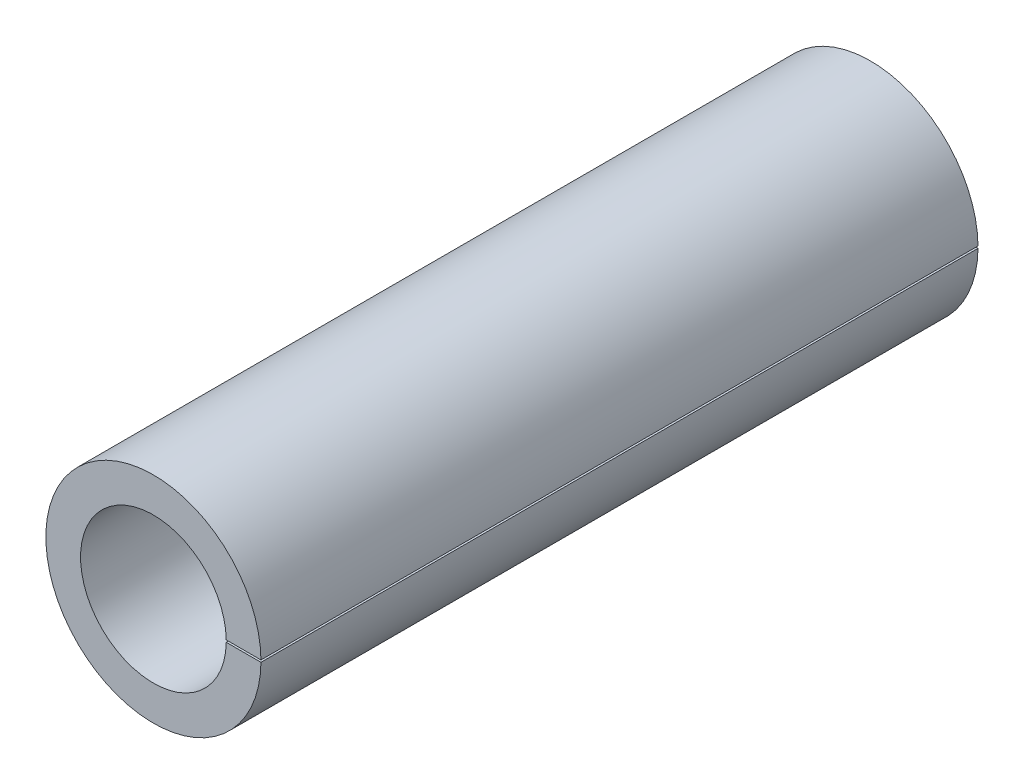
ISO-10303-21;
HEADER;
FILE_DESCRIPTION(('STEP AP214'),'2;1');
FILE_NAME('part.step','',(''),(''),'','','');
FILE_SCHEMA(('AUTOMOTIVE_DESIGN { 1 0 10303 214 1 1 1 1 }'));
ENDSEC;
DATA;
#1=APPLICATION_CONTEXT('core data for automotive mechanical design processes');
#2=APPLICATION_PROTOCOL_DEFINITION('international standard','automotive_design',2000,#1);
#3=PRODUCT_CONTEXT('',#1,'mechanical');
#4=PRODUCT('Part','Part','',(#3));
#5=PRODUCT_RELATED_PRODUCT_CATEGORY('part','',(#4));
#6=PRODUCT_DEFINITION_FORMATION('','',#4);
#7=PRODUCT_DEFINITION_CONTEXT('part definition',#1,'design');
#8=PRODUCT_DEFINITION('design','',#6,#7);
#9=PRODUCT_DEFINITION_SHAPE('','',#8);
#10=(LENGTH_UNIT() NAMED_UNIT(*) SI_UNIT(.MILLI.,.METRE.));
#11=(NAMED_UNIT(*) PLANE_ANGLE_UNIT() SI_UNIT($,.RADIAN.));
#12=(NAMED_UNIT(*) SI_UNIT($,.STERADIAN.) SOLID_ANGLE_UNIT());
#13=UNCERTAINTY_MEASURE_WITH_UNIT(LENGTH_MEASURE(1.E-05),#10,'distance_accuracy_value','');
#14=(GEOMETRIC_REPRESENTATION_CONTEXT(3) GLOBAL_UNCERTAINTY_ASSIGNED_CONTEXT((#13)) GLOBAL_UNIT_ASSIGNED_CONTEXT((#10,
#11,#12)) REPRESENTATION_CONTEXT('',''));
#15=CARTESIAN_POINT('',(0.,0.,0.));
#16=DIRECTION('',(0.,0.,1.));
#17=DIRECTION('',(1.,0.,0.));
#18=AXIS2_PLACEMENT_3D('',#15,#16,#17);
#19=CARTESIAN_POINT('',(0.,0.,15.875));
#20=DIRECTION('',(0.,0.,-1.));
#21=DIRECTION('',(-1.,0.,0.));
#22=AXIS2_PLACEMENT_3D('',#19,#20,#21);
#23=CYLINDRICAL_SURFACE('',#22,4.7625);
#24=DIRECTION('',(0.,0.,-1.));
#25=VECTOR('',#24,1.);
#26=CARTESIAN_POINT('',(4.76228739682939,0.0450000000000017,15.875));
#27=LINE('',#26,#25);
#28=CARTESIAN_POINT('',(4.76228739682939,0.0450000000000017,15.875));
#29=VERTEX_POINT('',#28);
#30=CARTESIAN_POINT('',(4.76228739682939,0.0450000000000017,-15.875));
#31=VERTEX_POINT('',#30);
#32=EDGE_CURVE('E114',#29,#31,#27,.T.);
#33=ORIENTED_EDGE('',*,*,#32,.T.);
#34=CARTESIAN_POINT('',(0.,0.,-15.875));
#35=DIRECTION('',(0.,0.,1.));
#36=DIRECTION('',(1.,0.,0.));
#37=AXIS2_PLACEMENT_3D('',#34,#35,#36);
#38=CIRCLE('',#37,4.7625);
#39=CARTESIAN_POINT('',(4.76228739682939,-0.045,-15.875));
#40=VERTEX_POINT('',#39);
#41=EDGE_CURVE('E108',#31,#40,#38,.T.);
#42=ORIENTED_EDGE('',*,*,#41,.T.);
#43=DIRECTION('',(0.,0.,-1.));
#44=VECTOR('',#43,1.);
#45=CARTESIAN_POINT('',(4.76228739682939,-0.045,15.875));
#46=LINE('',#45,#44);
#47=CARTESIAN_POINT('',(4.76228739682939,-0.045,15.875));
#48=VERTEX_POINT('',#47);
#49=EDGE_CURVE('E11',#48,#40,#46,.T.);
#50=ORIENTED_EDGE('',*,*,#49,.F.);
#51=CARTESIAN_POINT('',(0.,0.,15.875));
#52=DIRECTION('',(0.,0.,1.));
#53=DIRECTION('',(1.,0.,0.));
#54=AXIS2_PLACEMENT_3D('',#51,#52,#53);
#55=CIRCLE('',#54,4.7625);
#56=EDGE_CURVE('E124',#29,#48,#55,.T.);
#57=ORIENTED_EDGE('',*,*,#56,.F.);
#58=EDGE_LOOP('',(#33,#42,#50,#57));
#59=FACE_BOUND('',#58,.T.);
#60=ADVANCED_FACE('F47',(#59),#23,.T.);
#61=CARTESIAN_POINT('',(3.22548610910046,-0.045,15.875));
#62=DIRECTION('',(0.,-1.,0.));
#63=DIRECTION('',(0.,0.,-1.));
#64=AXIS2_PLACEMENT_3D('',#61,#62,#63);
#65=PLANE('',#64);
#66=ORIENTED_EDGE('',*,*,#49,.T.);
#67=DIRECTION('',(-1.,0.,0.));
#68=VECTOR('',#67,1.);
#69=CARTESIAN_POINT('',(3.22548610910046,-0.045,-15.875));
#70=LINE('',#69,#68);
#71=CARTESIAN_POINT('',(3.22548610910046,-0.045,-15.875));
#72=VERTEX_POINT('',#71);
#73=EDGE_CURVE('E98',#40,#72,#70,.T.);
#74=ORIENTED_EDGE('',*,*,#73,.T.);
#75=DIRECTION('',(0.,0.,-1.));
#76=VECTOR('',#75,1.);
#77=CARTESIAN_POINT('',(3.22548610910046,-0.045,15.875));
#78=LINE('',#77,#76);
#79=CARTESIAN_POINT('',(3.22548610910046,-0.045,15.875));
#80=VERTEX_POINT('',#79);
#81=EDGE_CURVE('E55',#80,#72,#78,.T.);
#82=ORIENTED_EDGE('',*,*,#81,.F.);
#83=DIRECTION('',(-1.,0.,0.));
#84=VECTOR('',#83,1.);
#85=CARTESIAN_POINT('',(3.22548610910046,-0.045,15.875));
#86=LINE('',#85,#84);
#87=EDGE_CURVE('E99',#48,#80,#86,.T.);
#88=ORIENTED_EDGE('',*,*,#87,.F.);
#89=EDGE_LOOP('',(#66,#74,#82,#88));
#90=FACE_BOUND('',#89,.T.);
#91=ADVANCED_FACE('F96',(#90),#65,.F.);
#92=CARTESIAN_POINT('',(0.,0.,15.875));
#93=DIRECTION('',(0.,0.,-1.));
#94=DIRECTION('',(-1.,0.,0.));
#95=AXIS2_PLACEMENT_3D('',#92,#93,#94);
#96=CYLINDRICAL_SURFACE('',#95,3.2258);
#97=ORIENTED_EDGE('',*,*,#81,.T.);
#98=CARTESIAN_POINT('',(0.,0.,-15.875));
#99=DIRECTION('',(0.,0.,-1.));
#100=DIRECTION('',(1.,0.,0.));
#101=AXIS2_PLACEMENT_3D('',#98,#99,#100);
#102=CIRCLE('',#101,3.2258);
#103=CARTESIAN_POINT('',(3.22548610910046,0.0450000000000012,-15.875));
#104=VERTEX_POINT('',#103);
#105=EDGE_CURVE('E111',#72,#104,#102,.T.);
#106=ORIENTED_EDGE('',*,*,#105,.T.);
#107=DIRECTION('',(0.,0.,-1.));
#108=VECTOR('',#107,1.);
#109=CARTESIAN_POINT('',(3.22548610910046,0.0450000000000012,15.875));
#110=LINE('',#109,#108);
#111=CARTESIAN_POINT('',(3.22548610910046,0.0450000000000012,15.875));
#112=VERTEX_POINT('',#111);
#113=EDGE_CURVE('E135',#112,#104,#110,.T.);
#114=ORIENTED_EDGE('',*,*,#113,.F.);
#115=CARTESIAN_POINT('',(0.,0.,15.875));
#116=DIRECTION('',(0.,0.,-1.));
#117=DIRECTION('',(1.,0.,0.));
#118=AXIS2_PLACEMENT_3D('',#115,#116,#117);
#119=CIRCLE('',#118,3.2258);
#120=EDGE_CURVE('E71',#80,#112,#119,.T.);
#121=ORIENTED_EDGE('',*,*,#120,.F.);
#122=EDGE_LOOP('',(#97,#106,#114,#121));
#123=FACE_BOUND('',#122,.T.);
#124=ADVANCED_FACE('F140',(#123),#96,.F.);
#125=CARTESIAN_POINT('',(3.22548610910046,0.0450000000000012,15.875));
#126=DIRECTION('',(0.,1.,0.));
#127=DIRECTION('',(-1.,0.,0.));
#128=AXIS2_PLACEMENT_3D('',#125,#126,#127);
#129=PLANE('',#128);
#130=ORIENTED_EDGE('',*,*,#113,.T.);
#131=DIRECTION('',(1.,0.,0.));
#132=VECTOR('',#131,1.);
#133=CARTESIAN_POINT('',(3.22548610910046,0.0450000000000012,-15.875));
#134=LINE('',#133,#132);
#135=EDGE_CURVE('E121',#104,#31,#134,.T.);
#136=ORIENTED_EDGE('',*,*,#135,.T.);
#137=ORIENTED_EDGE('',*,*,#32,.F.);
#138=DIRECTION('',(1.,0.,0.));
#139=VECTOR('',#138,1.);
#140=CARTESIAN_POINT('',(3.22548610910046,0.0450000000000012,15.875));
#141=LINE('',#140,#139);
#142=EDGE_CURVE('E64',#112,#29,#141,.T.);
#143=ORIENTED_EDGE('',*,*,#142,.F.);
#144=EDGE_LOOP('',(#130,#136,#137,#143));
#145=FACE_BOUND('',#144,.T.);
#146=ADVANCED_FACE('F142',(#145),#129,.F.);
#147=CARTESIAN_POINT('',(0.,0.,15.875));
#148=DIRECTION('',(0.,0.,1.));
#149=DIRECTION('',(1.,0.,0.));
#150=AXIS2_PLACEMENT_3D('',#147,#148,#149);
#151=PLANE('',#150);
#152=ORIENTED_EDGE('',*,*,#56,.T.);
#153=ORIENTED_EDGE('',*,*,#87,.T.);
#154=ORIENTED_EDGE('',*,*,#120,.T.);
#155=ORIENTED_EDGE('',*,*,#142,.T.);
#156=EDGE_LOOP('',(#152,#153,#154,#155));
#157=FACE_BOUND('',#156,.T.);
#158=ADVANCED_FACE('F143',(#157),#151,.T.);
#159=CARTESIAN_POINT('',(0.,0.,-15.875));
#160=DIRECTION('',(0.,0.,1.));
#161=DIRECTION('',(1.,0.,0.));
#162=AXIS2_PLACEMENT_3D('',#159,#160,#161);
#163=PLANE('',#162);
#164=ORIENTED_EDGE('',*,*,#41,.F.);
#165=ORIENTED_EDGE('',*,*,#135,.F.);
#166=ORIENTED_EDGE('',*,*,#105,.F.);
#167=ORIENTED_EDGE('',*,*,#73,.F.);
#168=EDGE_LOOP('',(#164,#165,#166,#167));
#169=FACE_BOUND('',#168,.T.);
#170=ADVANCED_FACE('F106',(#169),#163,.F.);
#171=CLOSED_SHELL('',(#60,#91,#124,#146,#158,#170));
#172=MANIFOLD_SOLID_BREP('B2',#171);
#173=ADVANCED_BREP_SHAPE_REPRESENTATION('',(#18,#172),#14);
#174=SHAPE_DEFINITION_REPRESENTATION(#9,#173);
ENDSEC;
END-ISO-10303-21;
